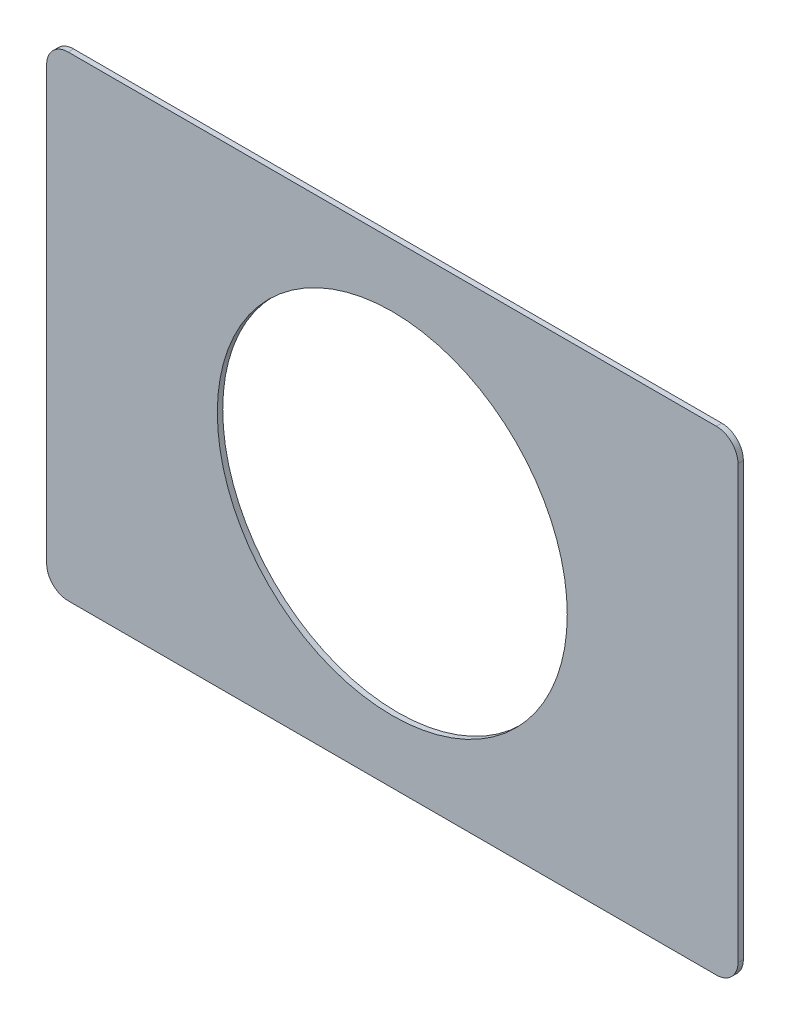
ISO-10303-21;
HEADER;
FILE_DESCRIPTION(('STEP AP214'),'2;1');
FILE_NAME('part.step','',(''),(''),'','','');
FILE_SCHEMA(('AUTOMOTIVE_DESIGN { 1 0 10303 214 1 1 1 1 }'));
ENDSEC;
DATA;
#1=APPLICATION_CONTEXT('core data for automotive mechanical design processes');
#2=APPLICATION_PROTOCOL_DEFINITION('international standard','automotive_design',2000,#1);
#3=PRODUCT_CONTEXT('',#1,'mechanical');
#4=PRODUCT('Part','Part','',(#3));
#5=PRODUCT_RELATED_PRODUCT_CATEGORY('part','',(#4));
#6=PRODUCT_DEFINITION_FORMATION('','',#4);
#7=PRODUCT_DEFINITION_CONTEXT('part definition',#1,'design');
#8=PRODUCT_DEFINITION('design','',#6,#7);
#9=PRODUCT_DEFINITION_SHAPE('','',#8);
#10=(LENGTH_UNIT() NAMED_UNIT(*) SI_UNIT(.MILLI.,.METRE.));
#11=(NAMED_UNIT(*) PLANE_ANGLE_UNIT() SI_UNIT($,.RADIAN.));
#12=(NAMED_UNIT(*) SI_UNIT($,.STERADIAN.) SOLID_ANGLE_UNIT());
#13=UNCERTAINTY_MEASURE_WITH_UNIT(LENGTH_MEASURE(1.E-05),#10,'distance_accuracy_value','');
#14=(GEOMETRIC_REPRESENTATION_CONTEXT(3) GLOBAL_UNCERTAINTY_ASSIGNED_CONTEXT((#13)) GLOBAL_UNIT_ASSIGNED_CONTEXT((#10,
#11,#12)) REPRESENTATION_CONTEXT('',''));
#15=CARTESIAN_POINT('',(0.,0.,0.));
#16=DIRECTION('',(0.,0.,1.));
#17=DIRECTION('',(1.,0.,0.));
#18=AXIS2_PLACEMENT_3D('',#15,#16,#17);
#19=CARTESIAN_POINT('',(0.,0.,0.));
#20=DIRECTION('',(0.,0.,1.));
#21=DIRECTION('',(-1.,0.,0.));
#22=AXIS2_PLACEMENT_3D('',#19,#20,#21);
#23=CYLINDRICAL_SURFACE('',#22,0.809908151922868);
#24=CARTESIAN_POINT('',(0.,0.,0.025));
#25=DIRECTION('',(0.,0.,-1.));
#26=DIRECTION('',(-1.,0.,0.));
#27=AXIS2_PLACEMENT_3D('',#24,#25,#26);
#28=CIRCLE('',#27,0.809908151922868);
#29=CARTESIAN_POINT('',(0.809908151922868,0.,0.025));
#30=VERTEX_POINT('',#29);
#31=EDGE_CURVE('E11',#30,#30,#28,.T.);
#32=ORIENTED_EDGE('',*,*,#31,.F.);
#33=DIRECTION('',(0.,0.,-1.));
#34=VECTOR('',#33,1.);
#35=CARTESIAN_POINT('',(0.809908151922868,0.,0.));
#36=LINE('',#35,#34);
#37=CARTESIAN_POINT('',(0.809908151922868,0.,0.));
#38=VERTEX_POINT('',#37);
#39=EDGE_CURVE('E24',#30,#38,#36,.T.);
#40=ORIENTED_EDGE('',*,*,#39,.T.);
#41=CARTESIAN_POINT('',(0.,0.,0.));
#42=DIRECTION('',(0.,0.,-1.));
#43=DIRECTION('',(-1.,0.,0.));
#44=AXIS2_PLACEMENT_3D('',#41,#42,#43);
#45=CIRCLE('',#44,0.809908151922868);
#46=EDGE_CURVE('E162',#38,#38,#45,.T.);
#47=ORIENTED_EDGE('',*,*,#46,.T.);
#48=ORIENTED_EDGE('',*,*,#39,.F.);
#49=EDGE_LOOP('',(#32,#40,#47,#48));
#50=FACE_BOUND('',#49,.T.);
#51=ADVANCED_FACE('F17',(#50),#23,.F.);
#52=CARTESIAN_POINT('',(-1.500000000017,-1.000000000003,0.));
#53=DIRECTION('',(0.,0.,1.));
#54=DIRECTION('',(-1.,0.,0.));
#55=AXIS2_PLACEMENT_3D('',#52,#53,#54);
#56=CYLINDRICAL_SURFACE('',#55,0.1);
#57=CARTESIAN_POINT('',(-1.500000000017,-1.000000000003,0.));
#58=DIRECTION('',(0.,0.,1.));
#59=DIRECTION('',(-1.,0.,0.));
#60=AXIS2_PLACEMENT_3D('',#57,#58,#59);
#61=CIRCLE('',#60,0.1);
#62=CARTESIAN_POINT('',(-1.600000000017,-1.000000000003,0.));
#63=VERTEX_POINT('',#62);
#64=CARTESIAN_POINT('',(-1.500000000017,-1.100000000003,0.));
#65=VERTEX_POINT('',#64);
#66=EDGE_CURVE('E160',#63,#65,#61,.T.);
#67=ORIENTED_EDGE('',*,*,#66,.T.);
#68=DIRECTION('',(0.,0.,1.));
#69=VECTOR('',#68,1.);
#70=CARTESIAN_POINT('',(-1.500000000017,-1.100000000003,0.));
#71=LINE('',#70,#69);
#72=CARTESIAN_POINT('',(-1.500000000017,-1.100000000003,0.025));
#73=VERTEX_POINT('',#72);
#74=EDGE_CURVE('E158',#65,#73,#71,.T.);
#75=ORIENTED_EDGE('',*,*,#74,.T.);
#76=CARTESIAN_POINT('',(-1.500000000017,-1.000000000003,0.025));
#77=DIRECTION('',(0.,0.,1.));
#78=DIRECTION('',(-1.,0.,0.));
#79=AXIS2_PLACEMENT_3D('',#76,#77,#78);
#80=CIRCLE('',#79,0.1);
#81=CARTESIAN_POINT('',(-1.600000000017,-1.000000000003,0.025));
#82=VERTEX_POINT('',#81);
#83=EDGE_CURVE('E108',#82,#73,#80,.T.);
#84=ORIENTED_EDGE('',*,*,#83,.F.);
#85=DIRECTION('',(0.,0.,1.));
#86=VECTOR('',#85,1.);
#87=CARTESIAN_POINT('',(-1.600000000017,-1.000000000003,0.));
#88=LINE('',#87,#86);
#89=EDGE_CURVE('E154',#63,#82,#88,.T.);
#90=ORIENTED_EDGE('',*,*,#89,.F.);
#91=EDGE_LOOP('',(#67,#75,#84,#90));
#92=FACE_BOUND('',#91,.T.);
#93=ADVANCED_FACE('F175',(#92),#56,.T.);
#94=CARTESIAN_POINT('',(-1.600000000017,1.000000000003,0.));
#95=DIRECTION('',(-1.,0.,0.));
#96=DIRECTION('',(0.,-1.,0.));
#97=AXIS2_PLACEMENT_3D('',#94,#95,#96);
#98=PLANE('',#97);
#99=DIRECTION('',(0.,-1.,0.));
#100=VECTOR('',#99,1.);
#101=CARTESIAN_POINT('',(-1.600000000017,1.000000000003,0.));
#102=LINE('',#101,#100);
#103=CARTESIAN_POINT('',(-1.600000000017,1.000000000003,0.));
#104=VERTEX_POINT('',#103);
#105=EDGE_CURVE('E151',#104,#63,#102,.T.);
#106=ORIENTED_EDGE('',*,*,#105,.T.);
#107=ORIENTED_EDGE('',*,*,#89,.T.);
#108=DIRECTION('',(0.,-1.,0.));
#109=VECTOR('',#108,1.);
#110=CARTESIAN_POINT('',(-1.600000000017,1.000000000003,0.025));
#111=LINE('',#110,#109);
#112=CARTESIAN_POINT('',(-1.600000000017,1.000000000003,0.025));
#113=VERTEX_POINT('',#112);
#114=EDGE_CURVE('E149',#113,#82,#111,.T.);
#115=ORIENTED_EDGE('',*,*,#114,.F.);
#116=DIRECTION('',(0.,0.,1.));
#117=VECTOR('',#116,1.);
#118=CARTESIAN_POINT('',(-1.600000000017,1.000000000003,0.));
#119=LINE('',#118,#117);
#120=EDGE_CURVE('E146',#104,#113,#119,.T.);
#121=ORIENTED_EDGE('',*,*,#120,.F.);
#122=EDGE_LOOP('',(#106,#107,#115,#121));
#123=FACE_BOUND('',#122,.T.);
#124=ADVANCED_FACE('F179',(#123),#98,.T.);
#125=CARTESIAN_POINT('',(-1.500000000017,1.000000000003,0.));
#126=DIRECTION('',(0.,0.,1.));
#127=DIRECTION('',(0.,1.,0.));
#128=AXIS2_PLACEMENT_3D('',#125,#126,#127);
#129=CYLINDRICAL_SURFACE('',#128,0.0999999999999998);
#130=CARTESIAN_POINT('',(-1.500000000017,1.000000000003,0.));
#131=DIRECTION('',(0.,0.,1.));
#132=DIRECTION('',(0.,1.,0.));
#133=AXIS2_PLACEMENT_3D('',#130,#131,#132);
#134=CIRCLE('',#133,0.0999999999999998);
#135=CARTESIAN_POINT('',(-1.500000000017,1.100000000003,0.));
#136=VERTEX_POINT('',#135);
#137=EDGE_CURVE('E143',#136,#104,#134,.T.);
#138=ORIENTED_EDGE('',*,*,#137,.T.);
#139=ORIENTED_EDGE('',*,*,#120,.T.);
#140=CARTESIAN_POINT('',(-1.500000000017,1.000000000003,0.025));
#141=DIRECTION('',(0.,0.,1.));
#142=DIRECTION('',(0.,1.,0.));
#143=AXIS2_PLACEMENT_3D('',#140,#141,#142);
#144=CIRCLE('',#143,0.0999999999999998);
#145=CARTESIAN_POINT('',(-1.500000000017,1.100000000003,0.025));
#146=VERTEX_POINT('',#145);
#147=EDGE_CURVE('E140',#146,#113,#144,.T.);
#148=ORIENTED_EDGE('',*,*,#147,.F.);
#149=DIRECTION('',(0.,0.,1.));
#150=VECTOR('',#149,1.);
#151=CARTESIAN_POINT('',(-1.500000000017,1.100000000003,0.));
#152=LINE('',#151,#150);
#153=EDGE_CURVE('E137',#136,#146,#152,.T.);
#154=ORIENTED_EDGE('',*,*,#153,.F.);
#155=EDGE_LOOP('',(#138,#139,#148,#154));
#156=FACE_BOUND('',#155,.T.);
#157=ADVANCED_FACE('F184',(#156),#129,.T.);
#158=CARTESIAN_POINT('',(1.500000000017,1.100000000003,0.));
#159=DIRECTION('',(0.,1.,0.));
#160=DIRECTION('',(-1.,0.,0.));
#161=AXIS2_PLACEMENT_3D('',#158,#159,#160);
#162=PLANE('',#161);
#163=DIRECTION('',(-1.,0.,0.));
#164=VECTOR('',#163,1.);
#165=CARTESIAN_POINT('',(1.500000000017,1.100000000003,0.));
#166=LINE('',#165,#164);
#167=CARTESIAN_POINT('',(1.500000000017,1.100000000003,0.));
#168=VERTEX_POINT('',#167);
#169=EDGE_CURVE('E134',#168,#136,#166,.T.);
#170=ORIENTED_EDGE('',*,*,#169,.T.);
#171=ORIENTED_EDGE('',*,*,#153,.T.);
#172=DIRECTION('',(-1.,0.,0.));
#173=VECTOR('',#172,1.);
#174=CARTESIAN_POINT('',(1.500000000017,1.100000000003,0.025));
#175=LINE('',#174,#173);
#176=CARTESIAN_POINT('',(1.500000000017,1.100000000003,0.025));
#177=VERTEX_POINT('',#176);
#178=EDGE_CURVE('E131',#177,#146,#175,.T.);
#179=ORIENTED_EDGE('',*,*,#178,.F.);
#180=DIRECTION('',(0.,0.,1.));
#181=VECTOR('',#180,1.);
#182=CARTESIAN_POINT('',(1.500000000017,1.100000000003,0.));
#183=LINE('',#182,#181);
#184=EDGE_CURVE('E128',#168,#177,#183,.T.);
#185=ORIENTED_EDGE('',*,*,#184,.F.);
#186=EDGE_LOOP('',(#170,#171,#179,#185));
#187=FACE_BOUND('',#186,.T.);
#188=ADVANCED_FACE('F190',(#187),#162,.T.);
#189=CARTESIAN_POINT('',(1.500000000017,1.000000000003,0.));
#190=DIRECTION('',(0.,0.,1.));
#191=DIRECTION('',(1.,0.,0.));
#192=AXIS2_PLACEMENT_3D('',#189,#190,#191);
#193=CYLINDRICAL_SURFACE('',#192,0.0999999999999998);
#194=CARTESIAN_POINT('',(1.500000000017,1.000000000003,0.));
#195=DIRECTION('',(0.,0.,1.));
#196=DIRECTION('',(1.,0.,0.));
#197=AXIS2_PLACEMENT_3D('',#194,#195,#196);
#198=CIRCLE('',#197,0.0999999999999998);
#199=CARTESIAN_POINT('',(1.600000000017,1.000000000003,0.));
#200=VERTEX_POINT('',#199);
#201=EDGE_CURVE('E125',#200,#168,#198,.T.);
#202=ORIENTED_EDGE('',*,*,#201,.T.);
#203=ORIENTED_EDGE('',*,*,#184,.T.);
#204=CARTESIAN_POINT('',(1.500000000017,1.000000000003,0.025));
#205=DIRECTION('',(0.,0.,1.));
#206=DIRECTION('',(1.,0.,0.));
#207=AXIS2_PLACEMENT_3D('',#204,#205,#206);
#208=CIRCLE('',#207,0.0999999999999998);
#209=CARTESIAN_POINT('',(1.600000000017,1.000000000003,0.025));
#210=VERTEX_POINT('',#209);
#211=EDGE_CURVE('E122',#210,#177,#208,.T.);
#212=ORIENTED_EDGE('',*,*,#211,.F.);
#213=DIRECTION('',(0.,0.,1.));
#214=VECTOR('',#213,1.);
#215=CARTESIAN_POINT('',(1.600000000017,1.000000000003,0.));
#216=LINE('',#215,#214);
#217=EDGE_CURVE('E119',#200,#210,#216,.T.);
#218=ORIENTED_EDGE('',*,*,#217,.F.);
#219=EDGE_LOOP('',(#202,#203,#212,#218));
#220=FACE_BOUND('',#219,.T.);
#221=ADVANCED_FACE('F194',(#220),#193,.T.);
#222=CARTESIAN_POINT('',(1.600000000017,-1.000000000003,0.));
#223=DIRECTION('',(1.,0.,0.));
#224=DIRECTION('',(0.,1.,0.));
#225=AXIS2_PLACEMENT_3D('',#222,#223,#224);
#226=PLANE('',#225);
#227=DIRECTION('',(0.,1.,0.));
#228=VECTOR('',#227,1.);
#229=CARTESIAN_POINT('',(1.600000000017,-1.000000000003,0.));
#230=LINE('',#229,#228);
#231=CARTESIAN_POINT('',(1.600000000017,-1.000000000003,0.));
#232=VERTEX_POINT('',#231);
#233=EDGE_CURVE('E116',#232,#200,#230,.T.);
#234=ORIENTED_EDGE('',*,*,#233,.T.);
#235=ORIENTED_EDGE('',*,*,#217,.T.);
#236=DIRECTION('',(0.,1.,0.));
#237=VECTOR('',#236,1.);
#238=CARTESIAN_POINT('',(1.600000000017,-1.000000000003,0.025));
#239=LINE('',#238,#237);
#240=CARTESIAN_POINT('',(1.600000000017,-1.000000000003,0.025));
#241=VERTEX_POINT('',#240);
#242=EDGE_CURVE('E114',#241,#210,#239,.T.);
#243=ORIENTED_EDGE('',*,*,#242,.F.);
#244=DIRECTION('',(0.,0.,1.));
#245=VECTOR('',#244,1.);
#246=CARTESIAN_POINT('',(1.600000000017,-1.000000000003,0.));
#247=LINE('',#246,#245);
#248=EDGE_CURVE('E90',#232,#241,#247,.T.);
#249=ORIENTED_EDGE('',*,*,#248,.F.);
#250=EDGE_LOOP('',(#234,#235,#243,#249));
#251=FACE_BOUND('',#250,.T.);
#252=ADVANCED_FACE('F198',(#251),#226,.T.);
#253=CARTESIAN_POINT('',(1.500000000017,-1.000000000003,0.));
#254=DIRECTION('',(0.,0.,1.));
#255=DIRECTION('',(0.,-1.,0.));
#256=AXIS2_PLACEMENT_3D('',#253,#254,#255);
#257=CYLINDRICAL_SURFACE('',#256,0.100000000000001);
#258=CARTESIAN_POINT('',(1.500000000017,-1.000000000003,0.));
#259=DIRECTION('',(0.,0.,1.));
#260=DIRECTION('',(0.,-1.,0.));
#261=AXIS2_PLACEMENT_3D('',#258,#259,#260);
#262=CIRCLE('',#261,0.100000000000001);
#263=CARTESIAN_POINT('',(1.500000000017,-1.100000000003,0.));
#264=VERTEX_POINT('',#263);
#265=EDGE_CURVE('E94',#264,#232,#262,.T.);
#266=ORIENTED_EDGE('',*,*,#265,.T.);
#267=ORIENTED_EDGE('',*,*,#248,.T.);
#268=CARTESIAN_POINT('',(1.500000000017,-1.000000000003,0.025));
#269=DIRECTION('',(0.,0.,1.));
#270=DIRECTION('',(0.,-1.,0.));
#271=AXIS2_PLACEMENT_3D('',#268,#269,#270);
#272=CIRCLE('',#271,0.100000000000001);
#273=CARTESIAN_POINT('',(1.500000000017,-1.100000000003,0.025));
#274=VERTEX_POINT('',#273);
#275=EDGE_CURVE('E83',#274,#241,#272,.T.);
#276=ORIENTED_EDGE('',*,*,#275,.F.);
#277=DIRECTION('',(0.,0.,1.));
#278=VECTOR('',#277,1.);
#279=CARTESIAN_POINT('',(1.500000000017,-1.100000000003,0.));
#280=LINE('',#279,#278);
#281=EDGE_CURVE('E87',#264,#274,#280,.T.);
#282=ORIENTED_EDGE('',*,*,#281,.F.);
#283=EDGE_LOOP('',(#266,#267,#276,#282));
#284=FACE_BOUND('',#283,.T.);
#285=ADVANCED_FACE('F86',(#284),#257,.T.);
#286=CARTESIAN_POINT('',(-1.500000000017,-1.100000000003,0.));
#287=DIRECTION('',(0.,-1.,0.));
#288=DIRECTION('',(1.,0.,0.));
#289=AXIS2_PLACEMENT_3D('',#286,#287,#288);
#290=PLANE('',#289);
#291=DIRECTION('',(1.,0.,0.));
#292=VECTOR('',#291,1.);
#293=CARTESIAN_POINT('',(-1.500000000017,-1.100000000003,0.));
#294=LINE('',#293,#292);
#295=EDGE_CURVE('E102',#65,#264,#294,.T.);
#296=ORIENTED_EDGE('',*,*,#295,.T.);
#297=ORIENTED_EDGE('',*,*,#281,.T.);
#298=DIRECTION('',(1.,0.,0.));
#299=VECTOR('',#298,1.);
#300=CARTESIAN_POINT('',(-1.500000000017,-1.100000000003,0.025));
#301=LINE('',#300,#299);
#302=EDGE_CURVE('E100',#73,#274,#301,.T.);
#303=ORIENTED_EDGE('',*,*,#302,.F.);
#304=ORIENTED_EDGE('',*,*,#74,.F.);
#305=EDGE_LOOP('',(#296,#297,#303,#304));
#306=FACE_BOUND('',#305,.T.);
#307=ADVANCED_FACE('F98',(#306),#290,.T.);
#308=CARTESIAN_POINT('',(0.,0.,0.025));
#309=DIRECTION('',(0.,0.,1.));
#310=DIRECTION('',(1.,0.,0.));
#311=AXIS2_PLACEMENT_3D('',#308,#309,#310);
#312=PLANE('',#311);
#313=ORIENTED_EDGE('',*,*,#302,.T.);
#314=ORIENTED_EDGE('',*,*,#275,.T.);
#315=ORIENTED_EDGE('',*,*,#242,.T.);
#316=ORIENTED_EDGE('',*,*,#211,.T.);
#317=ORIENTED_EDGE('',*,*,#178,.T.);
#318=ORIENTED_EDGE('',*,*,#147,.T.);
#319=ORIENTED_EDGE('',*,*,#114,.T.);
#320=ORIENTED_EDGE('',*,*,#83,.T.);
#321=EDGE_LOOP('',(#313,#314,#315,#316,#317,#318,#319,#320));
#322=FACE_BOUND('',#321,.T.);
#323=ORIENTED_EDGE('',*,*,#31,.T.);
#324=EDGE_LOOP('',(#323));
#325=FACE_BOUND('',#324,.T.);
#326=ADVANCED_FACE('F105',(#322,#325),#312,.T.);
#327=CARTESIAN_POINT('',(0.,0.,0.));
#328=DIRECTION('',(0.,0.,1.));
#329=DIRECTION('',(1.,0.,0.));
#330=AXIS2_PLACEMENT_3D('',#327,#328,#329);
#331=PLANE('',#330);
#332=ORIENTED_EDGE('',*,*,#295,.F.);
#333=ORIENTED_EDGE('',*,*,#66,.F.);
#334=ORIENTED_EDGE('',*,*,#105,.F.);
#335=ORIENTED_EDGE('',*,*,#137,.F.);
#336=ORIENTED_EDGE('',*,*,#169,.F.);
#337=ORIENTED_EDGE('',*,*,#201,.F.);
#338=ORIENTED_EDGE('',*,*,#233,.F.);
#339=ORIENTED_EDGE('',*,*,#265,.F.);
#340=EDGE_LOOP('',(#332,#333,#334,#335,#336,#337,#338,#339));
#341=FACE_BOUND('',#340,.T.);
#342=ORIENTED_EDGE('',*,*,#46,.F.);
#343=EDGE_LOOP('',(#342));
#344=FACE_BOUND('',#343,.T.);
#345=ADVANCED_FACE('F165',(#341,#344),#331,.F.);
#346=CLOSED_SHELL('',(#51,#93,#124,#157,#188,#221,#252,#285,#307,#326,#345));
#347=MANIFOLD_SOLID_BREP('B1',#346);
#348=ADVANCED_BREP_SHAPE_REPRESENTATION('',(#18,#347),#14);
#349=SHAPE_DEFINITION_REPRESENTATION(#9,#348);
ENDSEC;
END-ISO-10303-21;
